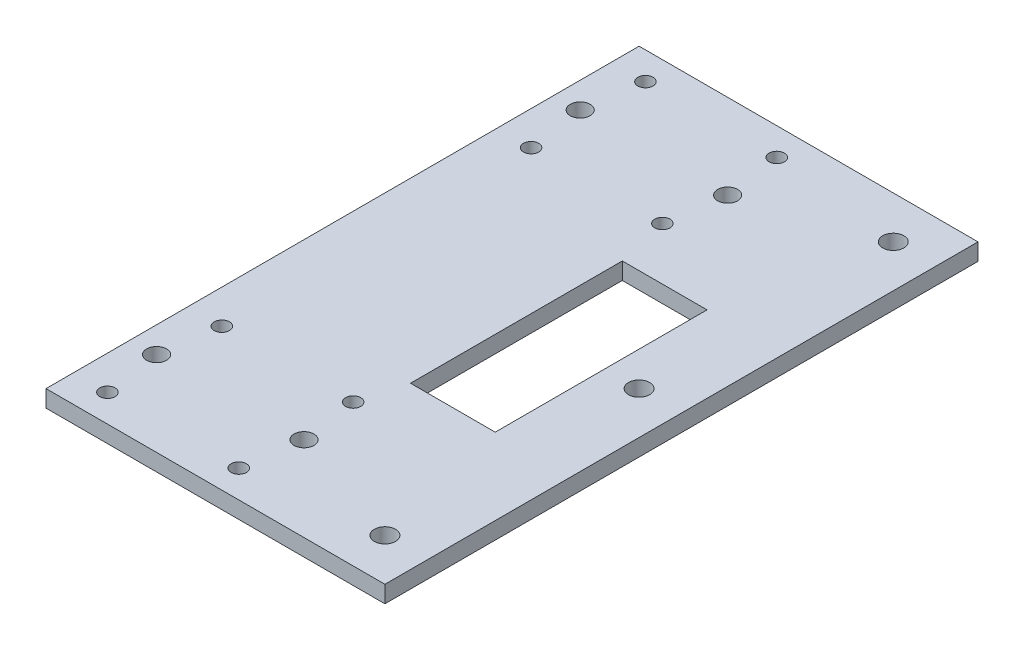
ISO-10303-21;
HEADER;
FILE_DESCRIPTION(('STEP AP214'),'2;1');
FILE_NAME('part.step','',(''),(''),'','','');
FILE_SCHEMA(('AUTOMOTIVE_DESIGN { 1 0 10303 214 1 1 1 1 }'));
ENDSEC;
DATA;
#1=APPLICATION_CONTEXT('core data for automotive mechanical design processes');
#2=APPLICATION_PROTOCOL_DEFINITION('international standard','automotive_design',2000,#1);
#3=PRODUCT_CONTEXT('',#1,'mechanical');
#4=PRODUCT('Part','Part','',(#3));
#5=PRODUCT_RELATED_PRODUCT_CATEGORY('part','',(#4));
#6=PRODUCT_DEFINITION_FORMATION('','',#4);
#7=PRODUCT_DEFINITION_CONTEXT('part definition',#1,'design');
#8=PRODUCT_DEFINITION('design','',#6,#7);
#9=PRODUCT_DEFINITION_SHAPE('','',#8);
#10=(LENGTH_UNIT() NAMED_UNIT(*) SI_UNIT(.MILLI.,.METRE.));
#11=(NAMED_UNIT(*) PLANE_ANGLE_UNIT() SI_UNIT($,.RADIAN.));
#12=(NAMED_UNIT(*) SI_UNIT($,.STERADIAN.) SOLID_ANGLE_UNIT());
#13=UNCERTAINTY_MEASURE_WITH_UNIT(LENGTH_MEASURE(1.E-05),#10,'distance_accuracy_value','');
#14=(GEOMETRIC_REPRESENTATION_CONTEXT(3) GLOBAL_UNCERTAINTY_ASSIGNED_CONTEXT((#13)) GLOBAL_UNIT_ASSIGNED_CONTEXT((#10,
#11,#12)) REPRESENTATION_CONTEXT('',''));
#15=CARTESIAN_POINT('',(0.,0.,0.));
#16=DIRECTION('',(0.,0.,1.));
#17=DIRECTION('',(1.,0.,0.));
#18=AXIS2_PLACEMENT_3D('',#15,#16,#17);
#19=CARTESIAN_POINT('',(0.,4.,0.));
#20=DIRECTION('',(0.,1.,0.));
#21=DIRECTION('',(0.,0.,1.));
#22=AXIS2_PLACEMENT_3D('',#19,#20,#21);
#23=PLANE('',#22);
#24=DIRECTION('',(0.,0.,1.));
#25=VECTOR('',#24,1.);
#26=CARTESIAN_POINT('',(-18.0745911128523,4.,-24.1155272127209));
#27=LINE('',#26,#25);
#28=CARTESIAN_POINT('',(-18.0745911128523,4.,-24.1155272127209));
#29=VERTEX_POINT('',#28);
#30=CARTESIAN_POINT('',(-18.0745911128523,4.,25.8844727872792));
#31=VERTEX_POINT('',#30);
#32=EDGE_CURVE('E122',#29,#31,#27,.T.);
#33=ORIENTED_EDGE('',*,*,#32,.T.);
#34=DIRECTION('',(-1.,0.,0.));
#35=VECTOR('',#34,1.);
#36=CARTESIAN_POINT('',(-38.0745911128523,4.,25.8844727872792));
#37=LINE('',#36,#35);
#38=CARTESIAN_POINT('',(-38.0745911128523,4.,25.8844727872792));
#39=VERTEX_POINT('',#38);
#40=EDGE_CURVE('E110',#31,#39,#37,.T.);
#41=ORIENTED_EDGE('',*,*,#40,.T.);
#42=DIRECTION('',(0.,0.,-1.));
#43=VECTOR('',#42,1.);
#44=CARTESIAN_POINT('',(-38.0745911128523,4.,-24.1155272127209));
#45=LINE('',#44,#43);
#46=CARTESIAN_POINT('',(-38.0745911128523,4.,-24.1155272127209));
#47=VERTEX_POINT('',#46);
#48=EDGE_CURVE('E136',#39,#47,#45,.T.);
#49=ORIENTED_EDGE('',*,*,#48,.T.);
#50=DIRECTION('',(1.,0.,0.));
#51=VECTOR('',#50,1.);
#52=CARTESIAN_POINT('',(-38.0745911128523,4.,-24.1155272127209));
#53=LINE('',#52,#51);
#54=EDGE_CURVE('E129',#47,#29,#53,.T.);
#55=ORIENTED_EDGE('',*,*,#54,.T.);
#56=EDGE_LOOP('',(#33,#41,#49,#55));
#57=FACE_BOUND('',#56,.T.);
#58=CARTESIAN_POINT('',(-72.,4.,36.5));
#59=DIRECTION('',(0.,1.,0.));
#60=DIRECTION('',(0.,0.,1.));
#61=AXIS2_PLACEMENT_3D('',#58,#59,#60);
#62=CIRCLE('',#61,1.79999999999999);
#63=CARTESIAN_POINT('',(-72.,4.,38.3));
#64=VERTEX_POINT('',#63);
#65=EDGE_CURVE('E160',#64,#64,#62,.T.);
#66=ORIENTED_EDGE('',*,*,#65,.F.);
#67=EDGE_LOOP('',(#66));
#68=FACE_BOUND('',#67,.T.);
#69=CARTESIAN_POINT('',(-41.,4.,-63.5));
#70=DIRECTION('',(0.,1.,0.));
#71=DIRECTION('',(0.,0.,1.));
#72=AXIS2_PLACEMENT_3D('',#69,#70,#71);
#73=CIRCLE('',#72,1.79999999999999);
#74=CARTESIAN_POINT('',(-41.,4.,-61.7));
#75=VERTEX_POINT('',#74);
#76=EDGE_CURVE('E209',#75,#75,#73,.F.);
#77=ORIENTED_EDGE('',*,*,#76,.T.);
#78=EDGE_LOOP('',(#77));
#79=FACE_BOUND('',#78,.T.);
#80=CARTESIAN_POINT('',(-72.,4.,-36.5));
#81=DIRECTION('',(0.,1.,0.));
#82=DIRECTION('',(0.,0.,1.));
#83=AXIS2_PLACEMENT_3D('',#80,#81,#82);
#84=CIRCLE('',#83,1.79999999999999);
#85=CARTESIAN_POINT('',(-72.,4.,-34.7));
#86=VERTEX_POINT('',#85);
#87=EDGE_CURVE('E249',#86,#86,#84,.F.);
#88=ORIENTED_EDGE('',*,*,#87,.T.);
#89=EDGE_LOOP('',(#88));
#90=FACE_BOUND('',#89,.T.);
#91=CARTESIAN_POINT('',(-73.9,4.,-50.));
#92=DIRECTION('',(0.,1.,0.));
#93=DIRECTION('',(0.,0.,1.));
#94=AXIS2_PLACEMENT_3D('',#91,#92,#93);
#95=CIRCLE('',#94,2.35);
#96=CARTESIAN_POINT('',(-73.9,4.,-47.65));
#97=VERTEX_POINT('',#96);
#98=EDGE_CURVE('E241',#97,#97,#95,.T.);
#99=ORIENTED_EDGE('',*,*,#98,.F.);
#100=EDGE_LOOP('',(#99));
#101=FACE_BOUND('',#100,.T.);
#102=CARTESIAN_POINT('',(-41.,4.,36.5));
#103=DIRECTION('',(0.,1.,0.));
#104=DIRECTION('',(0.,0.,1.));
#105=AXIS2_PLACEMENT_3D('',#102,#103,#104);
#106=CIRCLE('',#105,1.79999999999999);
#107=CARTESIAN_POINT('',(-41.,4.,38.3));
#108=VERTEX_POINT('',#107);
#109=EDGE_CURVE('E185',#108,#108,#106,.F.);
#110=ORIENTED_EDGE('',*,*,#109,.T.);
#111=EDGE_LOOP('',(#110));
#112=FACE_BOUND('',#111,.T.);
#113=CARTESIAN_POINT('',(-9.99999999999879,4.,60.));
#114=DIRECTION('',(0.,1.,0.));
#115=DIRECTION('',(0.,0.,1.));
#116=AXIS2_PLACEMENT_3D('',#113,#114,#115);
#117=CIRCLE('',#116,2.5);
#118=CARTESIAN_POINT('',(-9.99999999999879,4.,62.5));
#119=VERTEX_POINT('',#118);
#120=EDGE_CURVE('E193',#119,#119,#117,.T.);
#121=ORIENTED_EDGE('',*,*,#120,.F.);
#122=EDGE_LOOP('',(#121));
#123=FACE_BOUND('',#122,.T.);
#124=CARTESIAN_POINT('',(-9.99999999999941,4.,0.));
#125=DIRECTION('',(0.,1.,0.));
#126=DIRECTION('',(0.,0.,1.));
#127=AXIS2_PLACEMENT_3D('',#124,#125,#126);
#128=CIRCLE('',#127,2.5);
#129=CARTESIAN_POINT('',(-9.99999999999941,4.,2.50000000000002));
#130=VERTEX_POINT('',#129);
#131=EDGE_CURVE('E118',#130,#130,#128,.T.);
#132=ORIENTED_EDGE('',*,*,#131,.F.);
#133=EDGE_LOOP('',(#132));
#134=FACE_BOUND('',#133,.T.);
#135=CARTESIAN_POINT('',(-72.,4.,-63.5));
#136=DIRECTION('',(0.,1.,0.));
#137=DIRECTION('',(0.,0.,1.));
#138=AXIS2_PLACEMENT_3D('',#135,#136,#137);
#139=CIRCLE('',#138,1.79999999999999);
#140=CARTESIAN_POINT('',(-72.,4.,-61.7));
#141=VERTEX_POINT('',#140);
#142=EDGE_CURVE('E240',#141,#141,#139,.T.);
#143=ORIENTED_EDGE('',*,*,#142,.F.);
#144=EDGE_LOOP('',(#143));
#145=FACE_BOUND('',#144,.T.);
#146=DIRECTION('',(1.,0.,0.));
#147=VECTOR('',#146,1.);
#148=CARTESIAN_POINT('',(0.,4.,-70.));
#149=LINE('',#148,#147);
#150=CARTESIAN_POINT('',(-80.,4.,-70.));
#151=VERTEX_POINT('',#150);
#152=CARTESIAN_POINT('',(0.,4.,-70.));
#153=VERTEX_POINT('',#152);
#154=EDGE_CURVE('E276',#151,#153,#149,.T.);
#155=ORIENTED_EDGE('',*,*,#154,.F.);
#156=DIRECTION('',(0.,0.,-1.));
#157=VECTOR('',#156,1.);
#158=CARTESIAN_POINT('',(-80.,4.,0.));
#159=LINE('',#158,#157);
#160=CARTESIAN_POINT('',(-80.,4.,70.));
#161=VERTEX_POINT('',#160);
#162=EDGE_CURVE('E280',#161,#151,#159,.T.);
#163=ORIENTED_EDGE('',*,*,#162,.F.);
#164=DIRECTION('',(1.,0.,0.));
#165=VECTOR('',#164,1.);
#166=CARTESIAN_POINT('',(0.,4.,70.));
#167=LINE('',#166,#165);
#168=CARTESIAN_POINT('',(0.,4.,70.));
#169=VERTEX_POINT('',#168);
#170=EDGE_CURVE('E285',#161,#169,#167,.T.);
#171=ORIENTED_EDGE('',*,*,#170,.T.);
#172=DIRECTION('',(0.,0.,1.));
#173=VECTOR('',#172,1.);
#174=CARTESIAN_POINT('',(0.,4.,0.));
#175=LINE('',#174,#173);
#176=EDGE_CURVE('E288',#153,#169,#175,.T.);
#177=ORIENTED_EDGE('',*,*,#176,.F.);
#178=EDGE_LOOP('',(#155,#163,#171,#177));
#179=FACE_BOUND('',#178,.T.);
#180=CARTESIAN_POINT('',(-39.1,4.,50.));
#181=DIRECTION('',(0.,1.,0.));
#182=DIRECTION('',(0.,0.,1.));
#183=AXIS2_PLACEMENT_3D('',#180,#181,#182);
#184=CIRCLE('',#183,2.35);
#185=CARTESIAN_POINT('',(-39.1,4.,52.35));
#186=VERTEX_POINT('',#185);
#187=EDGE_CURVE('E177',#186,#186,#184,.T.);
#188=ORIENTED_EDGE('',*,*,#187,.F.);
#189=EDGE_LOOP('',(#188));
#190=FACE_BOUND('',#189,.T.);
#191=CARTESIAN_POINT('',(-41.,4.,63.5));
#192=DIRECTION('',(0.,1.,0.));
#193=DIRECTION('',(0.,0.,1.));
#194=AXIS2_PLACEMENT_3D('',#191,#192,#193);
#195=CIRCLE('',#194,1.79999999999999);
#196=CARTESIAN_POINT('',(-41.,4.,65.3));
#197=VERTEX_POINT('',#196);
#198=EDGE_CURVE('E169',#197,#197,#195,.T.);
#199=ORIENTED_EDGE('',*,*,#198,.F.);
#200=EDGE_LOOP('',(#199));
#201=FACE_BOUND('',#200,.T.);
#202=CARTESIAN_POINT('',(-72.,4.,63.5));
#203=DIRECTION('',(0.,1.,0.));
#204=DIRECTION('',(0.,0.,1.));
#205=AXIS2_PLACEMENT_3D('',#202,#203,#204);
#206=CIRCLE('',#205,1.79999999999999);
#207=CARTESIAN_POINT('',(-72.,4.,65.3));
#208=VERTEX_POINT('',#207);
#209=EDGE_CURVE('E161',#208,#208,#206,.F.);
#210=ORIENTED_EDGE('',*,*,#209,.T.);
#211=EDGE_LOOP('',(#210));
#212=FACE_BOUND('',#211,.T.);
#213=CARTESIAN_POINT('',(-41.,4.,-36.5));
#214=DIRECTION('',(0.,1.,0.));
#215=DIRECTION('',(0.,0.,1.));
#216=AXIS2_PLACEMENT_3D('',#213,#214,#215);
#217=CIRCLE('',#216,1.79999999999999);
#218=CARTESIAN_POINT('',(-41.,4.,-34.7));
#219=VERTEX_POINT('',#218);
#220=EDGE_CURVE('E257',#219,#219,#217,.T.);
#221=ORIENTED_EDGE('',*,*,#220,.F.);
#222=EDGE_LOOP('',(#221));
#223=FACE_BOUND('',#222,.T.);
#224=CARTESIAN_POINT('',(-39.1,4.,-50.));
#225=DIRECTION('',(0.,1.,0.));
#226=DIRECTION('',(0.,0.,1.));
#227=AXIS2_PLACEMENT_3D('',#224,#225,#226);
#228=CIRCLE('',#227,2.35);
#229=CARTESIAN_POINT('',(-39.1,4.,-47.65));
#230=VERTEX_POINT('',#229);
#231=EDGE_CURVE('E208',#230,#230,#228,.F.);
#232=ORIENTED_EDGE('',*,*,#231,.T.);
#233=EDGE_LOOP('',(#232));
#234=FACE_BOUND('',#233,.T.);
#235=CARTESIAN_POINT('',(-10.,4.,-60.));
#236=DIRECTION('',(0.,1.,0.));
#237=DIRECTION('',(0.,0.,1.));
#238=AXIS2_PLACEMENT_3D('',#235,#236,#237);
#239=CIRCLE('',#238,2.5);
#240=CARTESIAN_POINT('',(-10.,4.,-57.5));
#241=VERTEX_POINT('',#240);
#242=EDGE_CURVE('E217',#241,#241,#239,.T.);
#243=ORIENTED_EDGE('',*,*,#242,.F.);
#244=EDGE_LOOP('',(#243));
#245=FACE_BOUND('',#244,.T.);
#246=CARTESIAN_POINT('',(-73.9,4.,50.));
#247=DIRECTION('',(0.,1.,0.));
#248=DIRECTION('',(0.,0.,1.));
#249=AXIS2_PLACEMENT_3D('',#246,#247,#248);
#250=CIRCLE('',#249,2.35);
#251=CARTESIAN_POINT('',(-73.9,4.,52.35));
#252=VERTEX_POINT('',#251);
#253=EDGE_CURVE('E225',#252,#252,#250,.F.);
#254=ORIENTED_EDGE('',*,*,#253,.T.);
#255=EDGE_LOOP('',(#254));
#256=FACE_BOUND('',#255,.T.);
#257=ADVANCED_FACE('F46',(#57,#68,#79,#90,#101,#112,#123,#134,#145,#179,#190,#201,#212,#223,
#234,#245,#256),#23,.T.);
#258=CARTESIAN_POINT('',(0.,0.,0.));
#259=DIRECTION('',(0.,1.,0.));
#260=DIRECTION('',(0.,0.,1.));
#261=AXIS2_PLACEMENT_3D('',#258,#259,#260);
#262=PLANE('',#261);
#263=DIRECTION('',(-1.,0.,0.));
#264=VECTOR('',#263,1.);
#265=CARTESIAN_POINT('',(-38.0745911128523,0.,25.8844727872792));
#266=LINE('',#265,#264);
#267=CARTESIAN_POINT('',(-18.0745911128523,0.,25.8844727872792));
#268=VERTEX_POINT('',#267);
#269=CARTESIAN_POINT('',(-38.0745911128523,0.,25.8844727872792));
#270=VERTEX_POINT('',#269);
#271=EDGE_CURVE('E134',#268,#270,#266,.T.);
#272=ORIENTED_EDGE('',*,*,#271,.F.);
#273=DIRECTION('',(0.,0.,1.));
#274=VECTOR('',#273,1.);
#275=CARTESIAN_POINT('',(-18.0745911128523,0.,-24.1155272127209));
#276=LINE('',#275,#274);
#277=CARTESIAN_POINT('',(-18.0745911128523,0.,-24.1155272127209));
#278=VERTEX_POINT('',#277);
#279=EDGE_CURVE('E70',#278,#268,#276,.T.);
#280=ORIENTED_EDGE('',*,*,#279,.F.);
#281=DIRECTION('',(1.,0.,0.));
#282=VECTOR('',#281,1.);
#283=CARTESIAN_POINT('',(-38.0745911128523,0.,-24.1155272127209));
#284=LINE('',#283,#282);
#285=CARTESIAN_POINT('',(-38.0745911128523,0.,-24.1155272127209));
#286=VERTEX_POINT('',#285);
#287=EDGE_CURVE('E125',#286,#278,#284,.T.);
#288=ORIENTED_EDGE('',*,*,#287,.F.);
#289=DIRECTION('',(0.,0.,-1.));
#290=VECTOR('',#289,1.);
#291=CARTESIAN_POINT('',(-38.0745911128523,0.,-24.1155272127209));
#292=LINE('',#291,#290);
#293=EDGE_CURVE('E142',#270,#286,#292,.T.);
#294=ORIENTED_EDGE('',*,*,#293,.F.);
#295=EDGE_LOOP('',(#272,#280,#288,#294));
#296=FACE_BOUND('',#295,.T.);
#297=CARTESIAN_POINT('',(-72.,0.,36.5));
#298=DIRECTION('',(0.,1.,0.));
#299=DIRECTION('',(0.,0.,1.));
#300=AXIS2_PLACEMENT_3D('',#297,#298,#299);
#301=CIRCLE('',#300,1.79999999999999);
#302=CARTESIAN_POINT('',(-72.,0.,38.3));
#303=VERTEX_POINT('',#302);
#304=EDGE_CURVE('E229',#303,#303,#301,.T.);
#305=ORIENTED_EDGE('',*,*,#304,.T.);
#306=EDGE_LOOP('',(#305));
#307=FACE_BOUND('',#306,.T.);
#308=CARTESIAN_POINT('',(-10.,0.,-60.));
#309=DIRECTION('',(0.,1.,0.));
#310=DIRECTION('',(0.,0.,1.));
#311=AXIS2_PLACEMENT_3D('',#308,#309,#310);
#312=CIRCLE('',#311,2.5);
#313=CARTESIAN_POINT('',(-10.,0.,-57.5));
#314=VERTEX_POINT('',#313);
#315=EDGE_CURVE('E213',#314,#314,#312,.T.);
#316=ORIENTED_EDGE('',*,*,#315,.T.);
#317=EDGE_LOOP('',(#316));
#318=FACE_BOUND('',#317,.T.);
#319=CARTESIAN_POINT('',(-41.,0.,-36.5));
#320=DIRECTION('',(0.,1.,0.));
#321=DIRECTION('',(0.,0.,1.));
#322=AXIS2_PLACEMENT_3D('',#319,#320,#321);
#323=CIRCLE('',#322,1.79999999999999);
#324=CARTESIAN_POINT('',(-41.,0.,-34.7));
#325=VERTEX_POINT('',#324);
#326=EDGE_CURVE('E253',#325,#325,#323,.T.);
#327=ORIENTED_EDGE('',*,*,#326,.T.);
#328=EDGE_LOOP('',(#327));
#329=FACE_BOUND('',#328,.T.);
#330=CARTESIAN_POINT('',(-73.9,0.,-50.));
#331=DIRECTION('',(0.,1.,0.));
#332=DIRECTION('',(0.,0.,1.));
#333=AXIS2_PLACEMENT_3D('',#330,#331,#332);
#334=CIRCLE('',#333,2.35);
#335=CARTESIAN_POINT('',(-73.9,0.,-47.65));
#336=VERTEX_POINT('',#335);
#337=EDGE_CURVE('E236',#336,#336,#334,.T.);
#338=ORIENTED_EDGE('',*,*,#337,.T.);
#339=EDGE_LOOP('',(#338));
#340=FACE_BOUND('',#339,.T.);
#341=CARTESIAN_POINT('',(-41.,0.,63.5));
#342=DIRECTION('',(0.,1.,0.));
#343=DIRECTION('',(0.,0.,1.));
#344=AXIS2_PLACEMENT_3D('',#341,#342,#343);
#345=CIRCLE('',#344,1.79999999999999);
#346=CARTESIAN_POINT('',(-41.,0.,65.3));
#347=VERTEX_POINT('',#346);
#348=EDGE_CURVE('E165',#347,#347,#345,.T.);
#349=ORIENTED_EDGE('',*,*,#348,.T.);
#350=EDGE_LOOP('',(#349));
#351=FACE_BOUND('',#350,.T.);
#352=CARTESIAN_POINT('',(-39.1,0.,50.));
#353=DIRECTION('',(0.,1.,0.));
#354=DIRECTION('',(0.,0.,1.));
#355=AXIS2_PLACEMENT_3D('',#352,#353,#354);
#356=CIRCLE('',#355,2.35);
#357=CARTESIAN_POINT('',(-39.1,0.,52.35));
#358=VERTEX_POINT('',#357);
#359=EDGE_CURVE('E173',#358,#358,#356,.T.);
#360=ORIENTED_EDGE('',*,*,#359,.T.);
#361=EDGE_LOOP('',(#360));
#362=FACE_BOUND('',#361,.T.);
#363=CARTESIAN_POINT('',(-9.99999999999879,0.,60.));
#364=DIRECTION('',(0.,1.,0.));
#365=DIRECTION('',(0.,0.,1.));
#366=AXIS2_PLACEMENT_3D('',#363,#364,#365);
#367=CIRCLE('',#366,2.5);
#368=CARTESIAN_POINT('',(-9.99999999999879,0.,62.5));
#369=VERTEX_POINT('',#368);
#370=EDGE_CURVE('E189',#369,#369,#367,.T.);
#371=ORIENTED_EDGE('',*,*,#370,.T.);
#372=EDGE_LOOP('',(#371));
#373=FACE_BOUND('',#372,.T.);
#374=CARTESIAN_POINT('',(-9.99999999999941,0.,0.));
#375=DIRECTION('',(0.,1.,0.));
#376=DIRECTION('',(0.,0.,1.));
#377=AXIS2_PLACEMENT_3D('',#374,#375,#376);
#378=CIRCLE('',#377,2.5);
#379=CARTESIAN_POINT('',(-9.99999999999941,0.,2.50000000000002));
#380=VERTEX_POINT('',#379);
#381=EDGE_CURVE('E197',#380,#380,#378,.T.);
#382=ORIENTED_EDGE('',*,*,#381,.T.);
#383=EDGE_LOOP('',(#382));
#384=FACE_BOUND('',#383,.T.);
#385=CARTESIAN_POINT('',(-72.,0.,-63.5));
#386=DIRECTION('',(0.,1.,0.));
#387=DIRECTION('',(0.,0.,1.));
#388=AXIS2_PLACEMENT_3D('',#385,#386,#387);
#389=CIRCLE('',#388,1.79999999999999);
#390=CARTESIAN_POINT('',(-72.,0.,-61.7));
#391=VERTEX_POINT('',#390);
#392=EDGE_CURVE('E268',#391,#391,#389,.T.);
#393=ORIENTED_EDGE('',*,*,#392,.T.);
#394=EDGE_LOOP('',(#393));
#395=FACE_BOUND('',#394,.T.);
#396=DIRECTION('',(1.,0.,0.));
#397=VECTOR('',#396,1.);
#398=CARTESIAN_POINT('',(0.,0.,-70.));
#399=LINE('',#398,#397);
#400=CARTESIAN_POINT('',(-80.,0.,-70.));
#401=VERTEX_POINT('',#400);
#402=CARTESIAN_POINT('',(0.,0.,-70.));
#403=VERTEX_POINT('',#402);
#404=EDGE_CURVE('E272',#401,#403,#399,.T.);
#405=ORIENTED_EDGE('',*,*,#404,.T.);
#406=DIRECTION('',(0.,0.,1.));
#407=VECTOR('',#406,1.);
#408=CARTESIAN_POINT('',(0.,0.,0.));
#409=LINE('',#408,#407);
#410=CARTESIAN_POINT('',(0.,0.,70.));
#411=VERTEX_POINT('',#410);
#412=EDGE_CURVE('E281',#403,#411,#409,.T.);
#413=ORIENTED_EDGE('',*,*,#412,.T.);
#414=DIRECTION('',(1.,0.,0.));
#415=VECTOR('',#414,1.);
#416=CARTESIAN_POINT('',(0.,0.,70.));
#417=LINE('',#416,#415);
#418=CARTESIAN_POINT('',(-80.,0.,70.));
#419=VERTEX_POINT('',#418);
#420=EDGE_CURVE('E300',#419,#411,#417,.T.);
#421=ORIENTED_EDGE('',*,*,#420,.F.);
#422=DIRECTION('',(0.,0.,-1.));
#423=VECTOR('',#422,1.);
#424=CARTESIAN_POINT('',(-80.,0.,0.));
#425=LINE('',#424,#423);
#426=EDGE_CURVE('E296',#419,#401,#425,.T.);
#427=ORIENTED_EDGE('',*,*,#426,.T.);
#428=EDGE_LOOP('',(#405,#413,#421,#427));
#429=FACE_BOUND('',#428,.T.);
#430=CARTESIAN_POINT('',(-41.,0.,36.5));
#431=DIRECTION('',(0.,1.,0.));
#432=DIRECTION('',(0.,0.,1.));
#433=AXIS2_PLACEMENT_3D('',#430,#431,#432);
#434=CIRCLE('',#433,1.79999999999999);
#435=CARTESIAN_POINT('',(-41.,0.,38.3));
#436=VERTEX_POINT('',#435);
#437=EDGE_CURVE('E181',#436,#436,#434,.F.);
#438=ORIENTED_EDGE('',*,*,#437,.F.);
#439=EDGE_LOOP('',(#438));
#440=FACE_BOUND('',#439,.T.);
#441=CARTESIAN_POINT('',(-72.,0.,63.5));
#442=DIRECTION('',(0.,1.,0.));
#443=DIRECTION('',(0.,0.,1.));
#444=AXIS2_PLACEMENT_3D('',#441,#442,#443);
#445=CIRCLE('',#444,1.79999999999999);
#446=CARTESIAN_POINT('',(-72.,0.,65.3));
#447=VERTEX_POINT('',#446);
#448=EDGE_CURVE('E156',#447,#447,#445,.F.);
#449=ORIENTED_EDGE('',*,*,#448,.F.);
#450=EDGE_LOOP('',(#449));
#451=FACE_BOUND('',#450,.T.);
#452=CARTESIAN_POINT('',(-72.,0.,-36.5));
#453=DIRECTION('',(0.,1.,0.));
#454=DIRECTION('',(0.,0.,1.));
#455=AXIS2_PLACEMENT_3D('',#452,#453,#454);
#456=CIRCLE('',#455,1.79999999999999);
#457=CARTESIAN_POINT('',(-72.,0.,-34.7));
#458=VERTEX_POINT('',#457);
#459=EDGE_CURVE('E245',#458,#458,#456,.F.);
#460=ORIENTED_EDGE('',*,*,#459,.F.);
#461=EDGE_LOOP('',(#460));
#462=FACE_BOUND('',#461,.T.);
#463=CARTESIAN_POINT('',(-39.1,0.,-50.));
#464=DIRECTION('',(0.,1.,0.));
#465=DIRECTION('',(0.,0.,1.));
#466=AXIS2_PLACEMENT_3D('',#463,#464,#465);
#467=CIRCLE('',#466,2.35);
#468=CARTESIAN_POINT('',(-39.1,0.,-47.65));
#469=VERTEX_POINT('',#468);
#470=EDGE_CURVE('E261',#469,#469,#467,.F.);
#471=ORIENTED_EDGE('',*,*,#470,.F.);
#472=EDGE_LOOP('',(#471));
#473=FACE_BOUND('',#472,.T.);
#474=CARTESIAN_POINT('',(-41.,0.,-63.5));
#475=DIRECTION('',(0.,1.,0.));
#476=DIRECTION('',(0.,0.,1.));
#477=AXIS2_PLACEMENT_3D('',#474,#475,#476);
#478=CIRCLE('',#477,1.79999999999999);
#479=CARTESIAN_POINT('',(-41.,0.,-61.7));
#480=VERTEX_POINT('',#479);
#481=EDGE_CURVE('E204',#480,#480,#478,.F.);
#482=ORIENTED_EDGE('',*,*,#481,.F.);
#483=EDGE_LOOP('',(#482));
#484=FACE_BOUND('',#483,.T.);
#485=CARTESIAN_POINT('',(-73.9,0.,50.));
#486=DIRECTION('',(0.,1.,0.));
#487=DIRECTION('',(0.,0.,1.));
#488=AXIS2_PLACEMENT_3D('',#485,#486,#487);
#489=CIRCLE('',#488,2.35);
#490=CARTESIAN_POINT('',(-73.9,0.,52.35));
#491=VERTEX_POINT('',#490);
#492=EDGE_CURVE('E221',#491,#491,#489,.F.);
#493=ORIENTED_EDGE('',*,*,#492,.F.);
#494=EDGE_LOOP('',(#493));
#495=FACE_BOUND('',#494,.T.);
#496=ADVANCED_FACE('F321',(#296,#307,#318,#329,#340,#351,#362,#373,#384,#395,#429,#440,#451,
#462,#473,#484,#495),#262,.F.);
#497=CARTESIAN_POINT('',(0.,4.,-70.));
#498=DIRECTION('',(0.,0.,-1.));
#499=DIRECTION('',(-1.,0.,0.));
#500=AXIS2_PLACEMENT_3D('',#497,#498,#499);
#501=PLANE('',#500);
#502=ORIENTED_EDGE('',*,*,#404,.F.);
#503=DIRECTION('',(0.,-1.,0.));
#504=VECTOR('',#503,1.);
#505=CARTESIAN_POINT('',(-80.,4.,-70.));
#506=LINE('',#505,#504);
#507=EDGE_CURVE('E11',#151,#401,#506,.T.);
#508=ORIENTED_EDGE('',*,*,#507,.F.);
#509=ORIENTED_EDGE('',*,*,#154,.T.);
#510=DIRECTION('',(0.,-1.,0.));
#511=VECTOR('',#510,1.);
#512=CARTESIAN_POINT('',(0.,4.,-70.));
#513=LINE('',#512,#511);
#514=EDGE_CURVE('E292',#153,#403,#513,.T.);
#515=ORIENTED_EDGE('',*,*,#514,.T.);
#516=EDGE_LOOP('',(#502,#508,#509,#515));
#517=FACE_BOUND('',#516,.T.);
#518=ADVANCED_FACE('F48',(#517),#501,.T.);
#519=CARTESIAN_POINT('',(-80.,4.,0.));
#520=DIRECTION('',(-1.,0.,0.));
#521=DIRECTION('',(0.,0.,1.));
#522=AXIS2_PLACEMENT_3D('',#519,#520,#521);
#523=PLANE('',#522);
#524=ORIENTED_EDGE('',*,*,#426,.F.);
#525=DIRECTION('',(0.,-1.,0.));
#526=VECTOR('',#525,1.);
#527=CARTESIAN_POINT('',(-80.,4.,70.));
#528=LINE('',#527,#526);
#529=EDGE_CURVE('E55',#161,#419,#528,.T.);
#530=ORIENTED_EDGE('',*,*,#529,.F.);
#531=ORIENTED_EDGE('',*,*,#162,.T.);
#532=ORIENTED_EDGE('',*,*,#507,.T.);
#533=EDGE_LOOP('',(#524,#530,#531,#532));
#534=FACE_BOUND('',#533,.T.);
#535=ADVANCED_FACE('F324',(#534),#523,.T.);
#536=CARTESIAN_POINT('',(0.,4.,70.));
#537=DIRECTION('',(0.,0.,-1.));
#538=DIRECTION('',(-1.,0.,0.));
#539=AXIS2_PLACEMENT_3D('',#536,#537,#538);
#540=PLANE('',#539);
#541=ORIENTED_EDGE('',*,*,#420,.T.);
#542=DIRECTION('',(0.,-1.,0.));
#543=VECTOR('',#542,1.);
#544=CARTESIAN_POINT('',(0.,4.,70.));
#545=LINE('',#544,#543);
#546=EDGE_CURVE('E309',#169,#411,#545,.T.);
#547=ORIENTED_EDGE('',*,*,#546,.F.);
#548=ORIENTED_EDGE('',*,*,#170,.F.);
#549=ORIENTED_EDGE('',*,*,#529,.T.);
#550=EDGE_LOOP('',(#541,#547,#548,#549));
#551=FACE_BOUND('',#550,.T.);
#552=ADVANCED_FACE('F315',(#551),#540,.F.);
#553=CARTESIAN_POINT('',(0.,4.,0.));
#554=DIRECTION('',(1.,0.,0.));
#555=DIRECTION('',(0.,0.,-1.));
#556=AXIS2_PLACEMENT_3D('',#553,#554,#555);
#557=PLANE('',#556);
#558=ORIENTED_EDGE('',*,*,#412,.F.);
#559=ORIENTED_EDGE('',*,*,#514,.F.);
#560=ORIENTED_EDGE('',*,*,#176,.T.);
#561=ORIENTED_EDGE('',*,*,#546,.T.);
#562=EDGE_LOOP('',(#558,#559,#560,#561));
#563=FACE_BOUND('',#562,.T.);
#564=ADVANCED_FACE('F329',(#563),#557,.T.);
#565=CARTESIAN_POINT('',(-72.,0.,-63.5));
#566=DIRECTION('',(0.,1.,0.));
#567=DIRECTION('',(0.,0.,1.));
#568=AXIS2_PLACEMENT_3D('',#565,#566,#567);
#569=CYLINDRICAL_SURFACE('',#568,1.79999999999999);
#570=ORIENTED_EDGE('',*,*,#392,.F.);
#571=EDGE_LOOP('',(#570));
#572=FACE_BOUND('',#571,.T.);
#573=ORIENTED_EDGE('',*,*,#142,.T.);
#574=EDGE_LOOP('',(#573));
#575=FACE_BOUND('',#574,.T.);
#576=ADVANCED_FACE('F383',(#572,#575),#569,.F.);
#577=CARTESIAN_POINT('',(-9.99999999999941,0.,0.));
#578=DIRECTION('',(0.,1.,0.));
#579=DIRECTION('',(0.,0.,1.));
#580=AXIS2_PLACEMENT_3D('',#577,#578,#579);
#581=CYLINDRICAL_SURFACE('',#580,2.5);
#582=ORIENTED_EDGE('',*,*,#381,.F.);
#583=EDGE_LOOP('',(#582));
#584=FACE_BOUND('',#583,.T.);
#585=ORIENTED_EDGE('',*,*,#131,.T.);
#586=EDGE_LOOP('',(#585));
#587=FACE_BOUND('',#586,.T.);
#588=ADVANCED_FACE('F385',(#584,#587),#581,.F.);
#589=CARTESIAN_POINT('',(-9.99999999999879,0.,60.));
#590=DIRECTION('',(0.,1.,0.));
#591=DIRECTION('',(0.,0.,1.));
#592=AXIS2_PLACEMENT_3D('',#589,#590,#591);
#593=CYLINDRICAL_SURFACE('',#592,2.5);
#594=ORIENTED_EDGE('',*,*,#370,.F.);
#595=EDGE_LOOP('',(#594));
#596=FACE_BOUND('',#595,.T.);
#597=ORIENTED_EDGE('',*,*,#120,.T.);
#598=EDGE_LOOP('',(#597));
#599=FACE_BOUND('',#598,.T.);
#600=ADVANCED_FACE('F445',(#596,#599),#593,.F.);
#601=CARTESIAN_POINT('',(-41.,0.,36.5));
#602=DIRECTION('',(0.,1.,0.));
#603=DIRECTION('',(0.,0.,1.));
#604=AXIS2_PLACEMENT_3D('',#601,#602,#603);
#605=CYLINDRICAL_SURFACE('',#604,1.79999999999999);
#606=ORIENTED_EDGE('',*,*,#437,.T.);
#607=EDGE_LOOP('',(#606));
#608=FACE_BOUND('',#607,.T.);
#609=ORIENTED_EDGE('',*,*,#109,.F.);
#610=EDGE_LOOP('',(#609));
#611=FACE_BOUND('',#610,.T.);
#612=ADVANCED_FACE('F455',(#608,#611),#605,.F.);
#613=CARTESIAN_POINT('',(-39.1,0.,50.));
#614=DIRECTION('',(0.,1.,0.));
#615=DIRECTION('',(0.,0.,1.));
#616=AXIS2_PLACEMENT_3D('',#613,#614,#615);
#617=CYLINDRICAL_SURFACE('',#616,2.35);
#618=ORIENTED_EDGE('',*,*,#359,.F.);
#619=EDGE_LOOP('',(#618));
#620=FACE_BOUND('',#619,.T.);
#621=ORIENTED_EDGE('',*,*,#187,.T.);
#622=EDGE_LOOP('',(#621));
#623=FACE_BOUND('',#622,.T.);
#624=ADVANCED_FACE('F465',(#620,#623),#617,.F.);
#625=CARTESIAN_POINT('',(-41.,0.,63.5));
#626=DIRECTION('',(0.,1.,0.));
#627=DIRECTION('',(0.,0.,1.));
#628=AXIS2_PLACEMENT_3D('',#625,#626,#627);
#629=CYLINDRICAL_SURFACE('',#628,1.79999999999999);
#630=ORIENTED_EDGE('',*,*,#348,.F.);
#631=EDGE_LOOP('',(#630));
#632=FACE_BOUND('',#631,.T.);
#633=ORIENTED_EDGE('',*,*,#198,.T.);
#634=EDGE_LOOP('',(#633));
#635=FACE_BOUND('',#634,.T.);
#636=ADVANCED_FACE('F475',(#632,#635),#629,.F.);
#637=CARTESIAN_POINT('',(-72.,0.,63.5));
#638=DIRECTION('',(0.,1.,0.));
#639=DIRECTION('',(0.,0.,1.));
#640=AXIS2_PLACEMENT_3D('',#637,#638,#639);
#641=CYLINDRICAL_SURFACE('',#640,1.79999999999999);
#642=ORIENTED_EDGE('',*,*,#448,.T.);
#643=EDGE_LOOP('',(#642));
#644=FACE_BOUND('',#643,.T.);
#645=ORIENTED_EDGE('',*,*,#209,.F.);
#646=EDGE_LOOP('',(#645));
#647=FACE_BOUND('',#646,.T.);
#648=ADVANCED_FACE('F370',(#644,#647),#641,.F.);
#649=CARTESIAN_POINT('',(-73.9,0.,-50.));
#650=DIRECTION('',(0.,1.,0.));
#651=DIRECTION('',(0.,0.,1.));
#652=AXIS2_PLACEMENT_3D('',#649,#650,#651);
#653=CYLINDRICAL_SURFACE('',#652,2.35);
#654=ORIENTED_EDGE('',*,*,#337,.F.);
#655=EDGE_LOOP('',(#654));
#656=FACE_BOUND('',#655,.T.);
#657=ORIENTED_EDGE('',*,*,#98,.T.);
#658=EDGE_LOOP('',(#657));
#659=FACE_BOUND('',#658,.T.);
#660=ADVANCED_FACE('F366',(#656,#659),#653,.F.);
#661=CARTESIAN_POINT('',(-72.,0.,-36.5));
#662=DIRECTION('',(0.,1.,0.));
#663=DIRECTION('',(0.,0.,1.));
#664=AXIS2_PLACEMENT_3D('',#661,#662,#663);
#665=CYLINDRICAL_SURFACE('',#664,1.79999999999999);
#666=ORIENTED_EDGE('',*,*,#459,.T.);
#667=EDGE_LOOP('',(#666));
#668=FACE_BOUND('',#667,.T.);
#669=ORIENTED_EDGE('',*,*,#87,.F.);
#670=EDGE_LOOP('',(#669));
#671=FACE_BOUND('',#670,.T.);
#672=ADVANCED_FACE('F369',(#668,#671),#665,.F.);
#673=CARTESIAN_POINT('',(-41.,0.,-36.5));
#674=DIRECTION('',(0.,1.,0.));
#675=DIRECTION('',(0.,0.,1.));
#676=AXIS2_PLACEMENT_3D('',#673,#674,#675);
#677=CYLINDRICAL_SURFACE('',#676,1.79999999999999);
#678=ORIENTED_EDGE('',*,*,#326,.F.);
#679=EDGE_LOOP('',(#678));
#680=FACE_BOUND('',#679,.T.);
#681=ORIENTED_EDGE('',*,*,#220,.T.);
#682=EDGE_LOOP('',(#681));
#683=FACE_BOUND('',#682,.T.);
#684=ADVANCED_FACE('F374',(#680,#683),#677,.F.);
#685=CARTESIAN_POINT('',(-39.1,0.,-50.));
#686=DIRECTION('',(0.,1.,0.));
#687=DIRECTION('',(0.,0.,1.));
#688=AXIS2_PLACEMENT_3D('',#685,#686,#687);
#689=CYLINDRICAL_SURFACE('',#688,2.35);
#690=ORIENTED_EDGE('',*,*,#470,.T.);
#691=EDGE_LOOP('',(#690));
#692=FACE_BOUND('',#691,.T.);
#693=ORIENTED_EDGE('',*,*,#231,.F.);
#694=EDGE_LOOP('',(#693));
#695=FACE_BOUND('',#694,.T.);
#696=ADVANCED_FACE('F378',(#692,#695),#689,.F.);
#697=CARTESIAN_POINT('',(-41.,0.,-63.5));
#698=DIRECTION('',(0.,1.,0.));
#699=DIRECTION('',(0.,0.,1.));
#700=AXIS2_PLACEMENT_3D('',#697,#698,#699);
#701=CYLINDRICAL_SURFACE('',#700,1.79999999999999);
#702=ORIENTED_EDGE('',*,*,#481,.T.);
#703=EDGE_LOOP('',(#702));
#704=FACE_BOUND('',#703,.T.);
#705=ORIENTED_EDGE('',*,*,#76,.F.);
#706=EDGE_LOOP('',(#705));
#707=FACE_BOUND('',#706,.T.);
#708=ADVANCED_FACE('F361',(#704,#707),#701,.F.);
#709=CARTESIAN_POINT('',(-10.,0.,-60.));
#710=DIRECTION('',(0.,1.,0.));
#711=DIRECTION('',(0.,0.,1.));
#712=AXIS2_PLACEMENT_3D('',#709,#710,#711);
#713=CYLINDRICAL_SURFACE('',#712,2.5);
#714=ORIENTED_EDGE('',*,*,#315,.F.);
#715=EDGE_LOOP('',(#714));
#716=FACE_BOUND('',#715,.T.);
#717=ORIENTED_EDGE('',*,*,#242,.T.);
#718=EDGE_LOOP('',(#717));
#719=FACE_BOUND('',#718,.T.);
#720=ADVANCED_FACE('F352',(#716,#719),#713,.F.);
#721=CARTESIAN_POINT('',(-73.9,0.,50.));
#722=DIRECTION('',(0.,1.,0.));
#723=DIRECTION('',(0.,0.,1.));
#724=AXIS2_PLACEMENT_3D('',#721,#722,#723);
#725=CYLINDRICAL_SURFACE('',#724,2.35);
#726=ORIENTED_EDGE('',*,*,#492,.T.);
#727=EDGE_LOOP('',(#726));
#728=FACE_BOUND('',#727,.T.);
#729=ORIENTED_EDGE('',*,*,#253,.F.);
#730=EDGE_LOOP('',(#729));
#731=FACE_BOUND('',#730,.T.);
#732=ADVANCED_FACE('F349',(#728,#731),#725,.F.);
#733=CARTESIAN_POINT('',(-72.,0.,36.5));
#734=DIRECTION('',(0.,1.,0.));
#735=DIRECTION('',(0.,0.,1.));
#736=AXIS2_PLACEMENT_3D('',#733,#734,#735);
#737=CYLINDRICAL_SURFACE('',#736,1.79999999999999);
#738=ORIENTED_EDGE('',*,*,#304,.F.);
#739=EDGE_LOOP('',(#738));
#740=FACE_BOUND('',#739,.T.);
#741=ORIENTED_EDGE('',*,*,#65,.T.);
#742=EDGE_LOOP('',(#741));
#743=FACE_BOUND('',#742,.T.);
#744=ADVANCED_FACE('F351',(#740,#743),#737,.F.);
#745=CARTESIAN_POINT('',(-18.0745911128523,4.001,-24.1155272127209));
#746=DIRECTION('',(1.,0.,0.));
#747=DIRECTION('',(0.,0.,-1.));
#748=AXIS2_PLACEMENT_3D('',#745,#746,#747);
#749=PLANE('',#748);
#750=DIRECTION('',(0.,-1.,0.));
#751=VECTOR('',#750,1.);
#752=CARTESIAN_POINT('',(-18.0745911128523,4.001,-24.1155272127209));
#753=LINE('',#752,#751);
#754=EDGE_CURVE('E119',#29,#278,#753,.T.);
#755=ORIENTED_EDGE('',*,*,#754,.T.);
#756=ORIENTED_EDGE('',*,*,#279,.T.);
#757=DIRECTION('',(0.,-1.,0.));
#758=VECTOR('',#757,1.);
#759=CARTESIAN_POINT('',(-18.0745911128523,4.001,25.8844727872792));
#760=LINE('',#759,#758);
#761=EDGE_CURVE('E112',#31,#268,#760,.T.);
#762=ORIENTED_EDGE('',*,*,#761,.F.);
#763=ORIENTED_EDGE('',*,*,#32,.F.);
#764=EDGE_LOOP('',(#755,#756,#762,#763));
#765=FACE_BOUND('',#764,.T.);
#766=ADVANCED_FACE('F121',(#765),#749,.F.);
#767=CARTESIAN_POINT('',(-38.0745911128523,4.001,-24.1155272127209));
#768=DIRECTION('',(0.,0.,-1.));
#769=DIRECTION('',(-1.,0.,0.));
#770=AXIS2_PLACEMENT_3D('',#767,#768,#769);
#771=PLANE('',#770);
#772=DIRECTION('',(0.,-1.,0.));
#773=VECTOR('',#772,1.);
#774=CARTESIAN_POINT('',(-38.0745911128523,4.001,-24.1155272127209));
#775=LINE('',#774,#773);
#776=EDGE_CURVE('E151',#47,#286,#775,.T.);
#777=ORIENTED_EDGE('',*,*,#776,.T.);
#778=ORIENTED_EDGE('',*,*,#287,.T.);
#779=ORIENTED_EDGE('',*,*,#754,.F.);
#780=ORIENTED_EDGE('',*,*,#54,.F.);
#781=EDGE_LOOP('',(#777,#778,#779,#780));
#782=FACE_BOUND('',#781,.T.);
#783=ADVANCED_FACE('F550',(#782),#771,.F.);
#784=CARTESIAN_POINT('',(-38.0745911128523,4.001,-24.1155272127209));
#785=DIRECTION('',(-1.,0.,0.));
#786=DIRECTION('',(0.,0.,1.));
#787=AXIS2_PLACEMENT_3D('',#784,#785,#786);
#788=PLANE('',#787);
#789=DIRECTION('',(0.,-1.,0.));
#790=VECTOR('',#789,1.);
#791=CARTESIAN_POINT('',(-38.0745911128523,4.001,25.8844727872792));
#792=LINE('',#791,#790);
#793=EDGE_CURVE('E62',#39,#270,#792,.T.);
#794=ORIENTED_EDGE('',*,*,#793,.T.);
#795=ORIENTED_EDGE('',*,*,#293,.T.);
#796=ORIENTED_EDGE('',*,*,#776,.F.);
#797=ORIENTED_EDGE('',*,*,#48,.F.);
#798=EDGE_LOOP('',(#794,#795,#796,#797));
#799=FACE_BOUND('',#798,.T.);
#800=ADVANCED_FACE('F559',(#799),#788,.F.);
#801=CARTESIAN_POINT('',(-38.0745911128523,4.001,25.8844727872792));
#802=DIRECTION('',(0.,0.,1.));
#803=DIRECTION('',(1.,0.,0.));
#804=AXIS2_PLACEMENT_3D('',#801,#802,#803);
#805=PLANE('',#804);
#806=ORIENTED_EDGE('',*,*,#761,.T.);
#807=ORIENTED_EDGE('',*,*,#271,.T.);
#808=ORIENTED_EDGE('',*,*,#793,.F.);
#809=ORIENTED_EDGE('',*,*,#40,.F.);
#810=EDGE_LOOP('',(#806,#807,#808,#809));
#811=FACE_BOUND('',#810,.T.);
#812=ADVANCED_FACE('F111',(#811),#805,.F.);
#813=CLOSED_SHELL('',(#257,#496,#518,#535,#552,#564,#576,#588,#600,#612,#624,#636,#648,#660,
#672,#684,#696,#708,#720,#732,#744,#766,#783,#800,#812));
#814=MANIFOLD_SOLID_BREP('B2',#813);
#815=ADVANCED_BREP_SHAPE_REPRESENTATION('',(#18,#814),#14);
#816=SHAPE_DEFINITION_REPRESENTATION(#9,#815);
ENDSEC;
END-ISO-10303-21;
